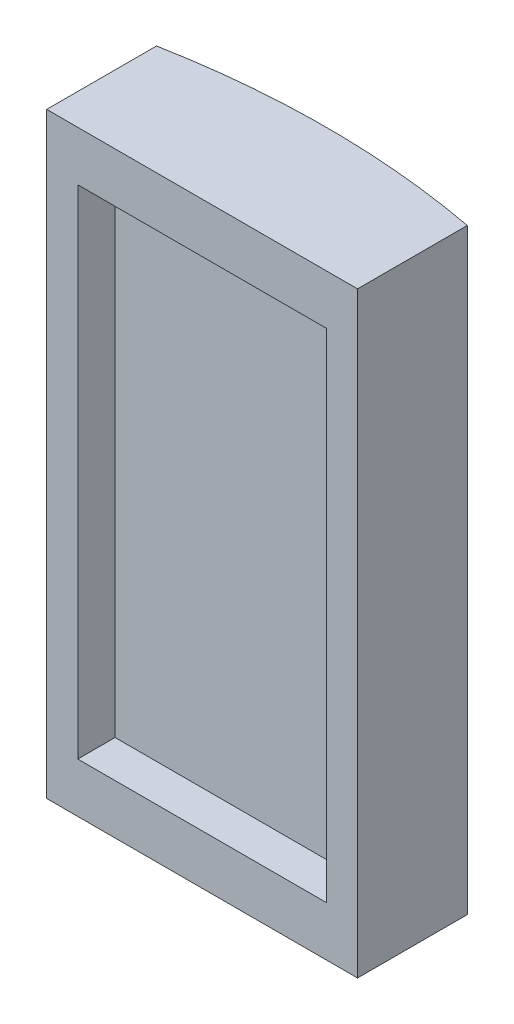
ISO-10303-21;
HEADER;
FILE_DESCRIPTION(('STEP AP214'),'2;1');
FILE_NAME('part.step','',(''),(''),'','','');
FILE_SCHEMA(('AUTOMOTIVE_DESIGN { 1 0 10303 214 1 1 1 1 }'));
ENDSEC;
DATA;
#1=APPLICATION_CONTEXT('core data for automotive mechanical design processes');
#2=APPLICATION_PROTOCOL_DEFINITION('international standard','automotive_design',2000,#1);
#3=PRODUCT_CONTEXT('',#1,'mechanical');
#4=PRODUCT('Part','Part','',(#3));
#5=PRODUCT_RELATED_PRODUCT_CATEGORY('part','',(#4));
#6=PRODUCT_DEFINITION_FORMATION('','',#4);
#7=PRODUCT_DEFINITION_CONTEXT('part definition',#1,'design');
#8=PRODUCT_DEFINITION('design','',#6,#7);
#9=PRODUCT_DEFINITION_SHAPE('','',#8);
#10=(LENGTH_UNIT() NAMED_UNIT(*) SI_UNIT(.MILLI.,.METRE.));
#11=(NAMED_UNIT(*) PLANE_ANGLE_UNIT() SI_UNIT($,.RADIAN.));
#12=(NAMED_UNIT(*) SI_UNIT($,.STERADIAN.) SOLID_ANGLE_UNIT());
#13=UNCERTAINTY_MEASURE_WITH_UNIT(LENGTH_MEASURE(1.E-05),#10,'distance_accuracy_value','');
#14=(GEOMETRIC_REPRESENTATION_CONTEXT(3) GLOBAL_UNCERTAINTY_ASSIGNED_CONTEXT((#13)) GLOBAL_UNIT_ASSIGNED_CONTEXT((#10,
#11,#12)) REPRESENTATION_CONTEXT('',''));
#15=CARTESIAN_POINT('',(0.,0.,0.));
#16=DIRECTION('',(0.,0.,1.));
#17=DIRECTION('',(1.,0.,0.));
#18=AXIS2_PLACEMENT_3D('',#15,#16,#17);
#19=CARTESIAN_POINT('',(0.,0.,10.));
#20=DIRECTION('',(1.,0.,0.));
#21=DIRECTION('',(0.,1.,0.));
#22=AXIS2_PLACEMENT_3D('',#19,#20,#21);
#23=PLANE('',#22);
#24=DIRECTION('',(0.,-1.,0.));
#25=VECTOR('',#24,1.);
#26=CARTESIAN_POINT('',(0.,96.,1.17085803399014));
#27=LINE('',#26,#25);
#28=CARTESIAN_POINT('',(0.,96.,1.17085803399014));
#29=VERTEX_POINT('',#28);
#30=CARTESIAN_POINT('',(0.,48.,1.17085803399014));
#31=VERTEX_POINT('',#30);
#32=EDGE_CURVE('E101',#29,#31,#27,.T.);
#33=ORIENTED_EDGE('',*,*,#32,.T.);
#34=DIRECTION('',(0.,0.,1.));
#35=VECTOR('',#34,1.);
#36=CARTESIAN_POINT('',(0.,48.,10.));
#37=LINE('',#36,#35);
#38=CARTESIAN_POINT('',(0.,48.,10.));
#39=VERTEX_POINT('',#38);
#40=EDGE_CURVE('E75',#31,#39,#37,.T.);
#41=ORIENTED_EDGE('',*,*,#40,.T.);
#42=DIRECTION('',(0.,-1.,0.));
#43=VECTOR('',#42,1.);
#44=CARTESIAN_POINT('',(0.,0.,10.));
#45=LINE('',#44,#43);
#46=CARTESIAN_POINT('',(0.,96.,10.));
#47=VERTEX_POINT('',#46);
#48=EDGE_CURVE('E108',#47,#39,#45,.T.);
#49=ORIENTED_EDGE('',*,*,#48,.F.);
#50=DIRECTION('',(0.,0.,1.));
#51=VECTOR('',#50,1.);
#52=CARTESIAN_POINT('',(0.,96.,1.17085803399013));
#53=LINE('',#52,#51);
#54=EDGE_CURVE('E93',#29,#47,#53,.T.);
#55=ORIENTED_EDGE('',*,*,#54,.F.);
#56=EDGE_LOOP('',(#33,#41,#49,#55));
#57=FACE_BOUND('',#56,.T.);
#58=ADVANCED_FACE('F38',(#57),#23,.F.);
#59=CARTESIAN_POINT('',(25.,0.,10.));
#60=DIRECTION('',(-1.,0.,0.));
#61=DIRECTION('',(0.,-1.,0.));
#62=AXIS2_PLACEMENT_3D('',#59,#60,#61);
#63=PLANE('',#62);
#64=DIRECTION('',(0.,1.,0.));
#65=VECTOR('',#64,1.);
#66=CARTESIAN_POINT('',(25.,0.,10.));
#67=LINE('',#66,#65);
#68=CARTESIAN_POINT('',(25.,48.,10.));
#69=VERTEX_POINT('',#68);
#70=CARTESIAN_POINT('',(25.,96.,10.));
#71=VERTEX_POINT('',#70);
#72=EDGE_CURVE('E41',#69,#71,#67,.T.);
#73=ORIENTED_EDGE('',*,*,#72,.F.);
#74=DIRECTION('',(0.,0.,1.));
#75=VECTOR('',#74,1.);
#76=CARTESIAN_POINT('',(25.,48.,0.));
#77=LINE('',#76,#75);
#78=CARTESIAN_POINT('',(25.,48.,1.17085803399014));
#79=VERTEX_POINT('',#78);
#80=EDGE_CURVE('E120',#79,#69,#77,.T.);
#81=ORIENTED_EDGE('',*,*,#80,.F.);
#82=DIRECTION('',(0.,-1.,0.));
#83=VECTOR('',#82,1.);
#84=CARTESIAN_POINT('',(25.,96.,1.17085803399014));
#85=LINE('',#84,#83);
#86=CARTESIAN_POINT('',(25.,96.,1.17085803399014));
#87=VERTEX_POINT('',#86);
#88=EDGE_CURVE('E104',#87,#79,#85,.T.);
#89=ORIENTED_EDGE('',*,*,#88,.F.);
#90=DIRECTION('',(0.,0.,-1.));
#91=VECTOR('',#90,1.);
#92=CARTESIAN_POINT('',(25.,96.,10.));
#93=LINE('',#92,#91);
#94=EDGE_CURVE('E95',#71,#87,#93,.T.);
#95=ORIENTED_EDGE('',*,*,#94,.F.);
#96=EDGE_LOOP('',(#73,#81,#89,#95));
#97=FACE_BOUND('',#96,.T.);
#98=ADVANCED_FACE('F115',(#97),#63,.F.);
#99=CARTESIAN_POINT('',(0.,0.,10.));
#100=DIRECTION('',(0.,0.,-1.));
#101=DIRECTION('',(-1.,0.,0.));
#102=AXIS2_PLACEMENT_3D('',#99,#100,#101);
#103=PLANE('',#102);
#104=DIRECTION('',(1.,0.,0.));
#105=VECTOR('',#104,1.);
#106=CARTESIAN_POINT('',(2.49999999999999,52.,10.));
#107=LINE('',#106,#105);
#108=CARTESIAN_POINT('',(2.49999999999999,52.,10.));
#109=VERTEX_POINT('',#108);
#110=CARTESIAN_POINT('',(22.5,52.,10.));
#111=VERTEX_POINT('',#110);
#112=EDGE_CURVE('E140',#109,#111,#107,.T.);
#113=ORIENTED_EDGE('',*,*,#112,.F.);
#114=DIRECTION('',(0.,-1.,0.));
#115=VECTOR('',#114,1.);
#116=CARTESIAN_POINT('',(2.49999999999999,92.,10.));
#117=LINE('',#116,#115);
#118=CARTESIAN_POINT('',(2.49999999999999,92.,10.));
#119=VERTEX_POINT('',#118);
#120=EDGE_CURVE('E53',#119,#109,#117,.T.);
#121=ORIENTED_EDGE('',*,*,#120,.F.);
#122=DIRECTION('',(-1.,0.,0.));
#123=VECTOR('',#122,1.);
#124=CARTESIAN_POINT('',(2.49999999999999,92.,10.));
#125=LINE('',#124,#123);
#126=CARTESIAN_POINT('',(22.5,92.,10.));
#127=VERTEX_POINT('',#126);
#128=EDGE_CURVE('E133',#127,#119,#125,.T.);
#129=ORIENTED_EDGE('',*,*,#128,.F.);
#130=DIRECTION('',(0.,1.,0.));
#131=VECTOR('',#130,1.);
#132=CARTESIAN_POINT('',(22.5,92.,10.));
#133=LINE('',#132,#131);
#134=EDGE_CURVE('E137',#111,#127,#133,.T.);
#135=ORIENTED_EDGE('',*,*,#134,.F.);
#136=EDGE_LOOP('',(#113,#121,#129,#135));
#137=FACE_BOUND('',#136,.T.);
#138=ORIENTED_EDGE('',*,*,#48,.T.);
#139=DIRECTION('',(1.,0.,0.));
#140=VECTOR('',#139,1.);
#141=CARTESIAN_POINT('',(0.,48.,10.));
#142=LINE('',#141,#140);
#143=EDGE_CURVE('E81',#39,#69,#142,.T.);
#144=ORIENTED_EDGE('',*,*,#143,.T.);
#145=ORIENTED_EDGE('',*,*,#72,.T.);
#146=DIRECTION('',(1.,0.,0.));
#147=VECTOR('',#146,1.);
#148=CARTESIAN_POINT('',(0.,96.,10.));
#149=LINE('',#148,#147);
#150=EDGE_CURVE('E105',#47,#71,#149,.T.);
#151=ORIENTED_EDGE('',*,*,#150,.F.);
#152=EDGE_LOOP('',(#138,#144,#145,#151));
#153=FACE_BOUND('',#152,.T.);
#154=ADVANCED_FACE('F113',(#137,#153),#103,.F.);
#155=CARTESIAN_POINT('',(12.5,96.,67.31));
#156=DIRECTION('',(0.,-1.,0.));
#157=DIRECTION('',(0.,0.,-1.));
#158=AXIS2_PLACEMENT_3D('',#155,#156,#157);
#159=CYLINDRICAL_SURFACE('',#158,67.3100000000001);
#160=ORIENTED_EDGE('',*,*,#88,.T.);
#161=CARTESIAN_POINT('',(12.5,48.,67.31));
#162=DIRECTION('',(0.,1.,0.));
#163=DIRECTION('',(0.,0.,1.));
#164=AXIS2_PLACEMENT_3D('',#161,#162,#163);
#165=CIRCLE('',#164,67.3100000000001);
#166=EDGE_CURVE('E11',#79,#31,#165,.T.);
#167=ORIENTED_EDGE('',*,*,#166,.T.);
#168=ORIENTED_EDGE('',*,*,#32,.F.);
#169=CARTESIAN_POINT('',(12.5,96.,67.31));
#170=DIRECTION('',(0.,1.,0.));
#171=DIRECTION('',(0.,0.,1.));
#172=AXIS2_PLACEMENT_3D('',#169,#170,#171);
#173=CIRCLE('',#172,67.3100000000001);
#174=EDGE_CURVE('E89',#87,#29,#173,.T.);
#175=ORIENTED_EDGE('',*,*,#174,.F.);
#176=EDGE_LOOP('',(#160,#167,#168,#175));
#177=FACE_BOUND('',#176,.T.);
#178=ADVANCED_FACE('F102',(#177),#159,.T.);
#179=CARTESIAN_POINT('',(12.5,96.,67.31));
#180=DIRECTION('',(0.,1.,0.));
#181=DIRECTION('',(0.,0.,1.));
#182=AXIS2_PLACEMENT_3D('',#179,#180,#181);
#183=PLANE('',#182);
#184=ORIENTED_EDGE('',*,*,#94,.T.);
#185=ORIENTED_EDGE('',*,*,#174,.T.);
#186=ORIENTED_EDGE('',*,*,#54,.T.);
#187=ORIENTED_EDGE('',*,*,#150,.T.);
#188=EDGE_LOOP('',(#184,#185,#186,#187));
#189=FACE_BOUND('',#188,.T.);
#190=ADVANCED_FACE('F91',(#189),#183,.T.);
#191=CARTESIAN_POINT('',(-23.,48.,0.));
#192=DIRECTION('',(0.,1.,0.));
#193=DIRECTION('',(-1.,0.,0.));
#194=AXIS2_PLACEMENT_3D('',#191,#192,#193);
#195=PLANE('',#194);
#196=ORIENTED_EDGE('',*,*,#40,.F.);
#197=ORIENTED_EDGE('',*,*,#166,.F.);
#198=ORIENTED_EDGE('',*,*,#80,.T.);
#199=ORIENTED_EDGE('',*,*,#143,.F.);
#200=EDGE_LOOP('',(#196,#197,#198,#199));
#201=FACE_BOUND('',#200,.T.);
#202=ADVANCED_FACE('F209',(#201),#195,.F.);
#203=CARTESIAN_POINT('',(2.49999999999999,92.,7.));
#204=DIRECTION('',(-1.,0.,0.));
#205=DIRECTION('',(0.,-1.,0.));
#206=AXIS2_PLACEMENT_3D('',#203,#204,#205);
#207=PLANE('',#206);
#208=ORIENTED_EDGE('',*,*,#120,.T.);
#209=DIRECTION('',(0.,0.,1.));
#210=VECTOR('',#209,1.);
#211=CARTESIAN_POINT('',(2.49999999999999,52.,7.));
#212=LINE('',#211,#210);
#213=CARTESIAN_POINT('',(2.49999999999999,52.,7.));
#214=VERTEX_POINT('',#213);
#215=EDGE_CURVE('E123',#214,#109,#212,.T.);
#216=ORIENTED_EDGE('',*,*,#215,.F.);
#217=DIRECTION('',(0.,-1.,0.));
#218=VECTOR('',#217,1.);
#219=CARTESIAN_POINT('',(2.49999999999999,92.,7.));
#220=LINE('',#219,#218);
#221=CARTESIAN_POINT('',(2.49999999999999,92.,7.));
#222=VERTEX_POINT('',#221);
#223=EDGE_CURVE('E136',#222,#214,#220,.T.);
#224=ORIENTED_EDGE('',*,*,#223,.F.);
#225=DIRECTION('',(0.,0.,1.));
#226=VECTOR('',#225,1.);
#227=CARTESIAN_POINT('',(2.49999999999999,92.,7.));
#228=LINE('',#227,#226);
#229=EDGE_CURVE('E122',#222,#119,#228,.T.);
#230=ORIENTED_EDGE('',*,*,#229,.T.);
#231=EDGE_LOOP('',(#208,#216,#224,#230));
#232=FACE_BOUND('',#231,.T.);
#233=ADVANCED_FACE('F163',(#232),#207,.F.);
#234=CARTESIAN_POINT('',(2.49999999999999,92.,7.));
#235=DIRECTION('',(0.,1.,0.));
#236=DIRECTION('',(0.,0.,1.));
#237=AXIS2_PLACEMENT_3D('',#234,#235,#236);
#238=PLANE('',#237);
#239=ORIENTED_EDGE('',*,*,#128,.T.);
#240=ORIENTED_EDGE('',*,*,#229,.F.);
#241=DIRECTION('',(-1.,0.,0.));
#242=VECTOR('',#241,1.);
#243=CARTESIAN_POINT('',(2.49999999999999,92.,7.));
#244=LINE('',#243,#242);
#245=CARTESIAN_POINT('',(22.5,92.,7.));
#246=VERTEX_POINT('',#245);
#247=EDGE_CURVE('E126',#246,#222,#244,.T.);
#248=ORIENTED_EDGE('',*,*,#247,.F.);
#249=DIRECTION('',(0.,0.,1.));
#250=VECTOR('',#249,1.);
#251=CARTESIAN_POINT('',(22.5,92.,7.));
#252=LINE('',#251,#250);
#253=EDGE_CURVE('E129',#246,#127,#252,.T.);
#254=ORIENTED_EDGE('',*,*,#253,.T.);
#255=EDGE_LOOP('',(#239,#240,#248,#254));
#256=FACE_BOUND('',#255,.T.);
#257=ADVANCED_FACE('F176',(#256),#238,.F.);
#258=CARTESIAN_POINT('',(22.5,92.,7.));
#259=DIRECTION('',(1.,0.,0.));
#260=DIRECTION('',(0.,1.,0.));
#261=AXIS2_PLACEMENT_3D('',#258,#259,#260);
#262=PLANE('',#261);
#263=ORIENTED_EDGE('',*,*,#134,.T.);
#264=ORIENTED_EDGE('',*,*,#253,.F.);
#265=DIRECTION('',(0.,1.,0.));
#266=VECTOR('',#265,1.);
#267=CARTESIAN_POINT('',(22.5,92.,7.));
#268=LINE('',#267,#266);
#269=CARTESIAN_POINT('',(22.5,52.,7.));
#270=VERTEX_POINT('',#269);
#271=EDGE_CURVE('E146',#270,#246,#268,.T.);
#272=ORIENTED_EDGE('',*,*,#271,.F.);
#273=DIRECTION('',(0.,0.,1.));
#274=VECTOR('',#273,1.);
#275=CARTESIAN_POINT('',(22.5,52.,7.));
#276=LINE('',#275,#274);
#277=EDGE_CURVE('E125',#270,#111,#276,.T.);
#278=ORIENTED_EDGE('',*,*,#277,.T.);
#279=EDGE_LOOP('',(#263,#264,#272,#278));
#280=FACE_BOUND('',#279,.T.);
#281=ADVANCED_FACE('F181',(#280),#262,.F.);
#282=CARTESIAN_POINT('',(2.49999999999999,52.,7.));
#283=DIRECTION('',(0.,-1.,0.));
#284=DIRECTION('',(0.,0.,-1.));
#285=AXIS2_PLACEMENT_3D('',#282,#283,#284);
#286=PLANE('',#285);
#287=ORIENTED_EDGE('',*,*,#112,.T.);
#288=ORIENTED_EDGE('',*,*,#277,.F.);
#289=DIRECTION('',(1.,0.,0.));
#290=VECTOR('',#289,1.);
#291=CARTESIAN_POINT('',(2.49999999999999,52.,7.));
#292=LINE('',#291,#290);
#293=EDGE_CURVE('E149',#214,#270,#292,.T.);
#294=ORIENTED_EDGE('',*,*,#293,.F.);
#295=ORIENTED_EDGE('',*,*,#215,.T.);
#296=EDGE_LOOP('',(#287,#288,#294,#295));
#297=FACE_BOUND('',#296,.T.);
#298=ADVANCED_FACE('F186',(#297),#286,.F.);
#299=CARTESIAN_POINT('',(0.,0.,7.));
#300=DIRECTION('',(0.,0.,1.));
#301=DIRECTION('',(1.,0.,0.));
#302=AXIS2_PLACEMENT_3D('',#299,#300,#301);
#303=PLANE('',#302);
#304=ORIENTED_EDGE('',*,*,#223,.T.);
#305=ORIENTED_EDGE('',*,*,#293,.T.);
#306=ORIENTED_EDGE('',*,*,#271,.T.);
#307=ORIENTED_EDGE('',*,*,#247,.T.);
#308=EDGE_LOOP('',(#304,#305,#306,#307));
#309=FACE_BOUND('',#308,.T.);
#310=ADVANCED_FACE('F156',(#309),#303,.T.);
#311=CLOSED_SHELL('',(#58,#98,#154,#178,#190,#202,#233,#257,#281,#298,#310));
#312=MANIFOLD_SOLID_BREP('B2',#311);
#313=ADVANCED_BREP_SHAPE_REPRESENTATION('',(#18,#312),#14);
#314=SHAPE_DEFINITION_REPRESENTATION(#9,#313);
ENDSEC;
END-ISO-10303-21;
